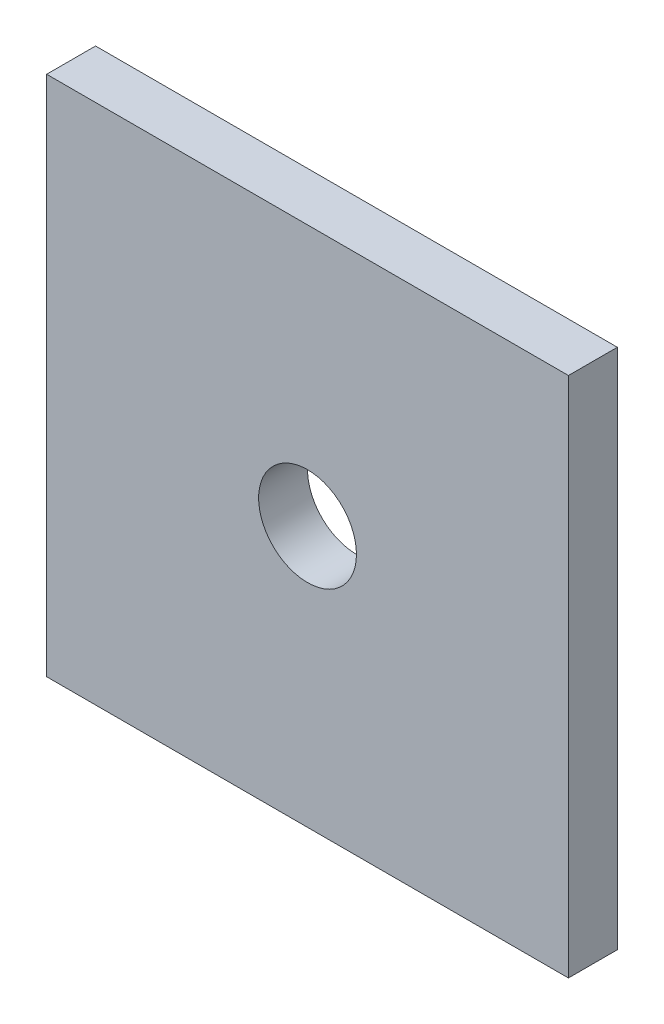
ISO-10303-21;
HEADER;
FILE_DESCRIPTION(('STEP AP214'),'2;1');
FILE_NAME('part.step','',(''),(''),'','','');
FILE_SCHEMA(('AUTOMOTIVE_DESIGN { 1 0 10303 214 1 1 1 1 }'));
ENDSEC;
DATA;
#1=APPLICATION_CONTEXT('core data for automotive mechanical design processes');
#2=APPLICATION_PROTOCOL_DEFINITION('international standard','automotive_design',2000,#1);
#3=PRODUCT_CONTEXT('',#1,'mechanical');
#4=PRODUCT('Part','Part','',(#3));
#5=PRODUCT_RELATED_PRODUCT_CATEGORY('part','',(#4));
#6=PRODUCT_DEFINITION_FORMATION('','',#4);
#7=PRODUCT_DEFINITION_CONTEXT('part definition',#1,'design');
#8=PRODUCT_DEFINITION('design','',#6,#7);
#9=PRODUCT_DEFINITION_SHAPE('','',#8);
#10=(LENGTH_UNIT() NAMED_UNIT(*) SI_UNIT(.MILLI.,.METRE.));
#11=(NAMED_UNIT(*) PLANE_ANGLE_UNIT() SI_UNIT($,.RADIAN.));
#12=(NAMED_UNIT(*) SI_UNIT($,.STERADIAN.) SOLID_ANGLE_UNIT());
#13=UNCERTAINTY_MEASURE_WITH_UNIT(LENGTH_MEASURE(1.E-05),#10,'distance_accuracy_value','');
#14=(GEOMETRIC_REPRESENTATION_CONTEXT(3) GLOBAL_UNCERTAINTY_ASSIGNED_CONTEXT((#13)) GLOBAL_UNIT_ASSIGNED_CONTEXT((#10,
#11,#12)) REPRESENTATION_CONTEXT('',''));
#15=CARTESIAN_POINT('',(0.,0.,0.));
#16=DIRECTION('',(0.,0.,1.));
#17=DIRECTION('',(1.,0.,0.));
#18=AXIS2_PLACEMENT_3D('',#15,#16,#17);
#19=CARTESIAN_POINT('',(-13.4747886581037,19.0476190476191,3.));
#20=DIRECTION('',(1.,0.,0.));
#21=DIRECTION('',(0.,1.,0.));
#22=AXIS2_PLACEMENT_3D('',#19,#20,#21);
#23=PLANE('',#22);
#24=DIRECTION('',(0.,-1.,0.));
#25=VECTOR('',#24,1.);
#26=CARTESIAN_POINT('',(-13.4747886581037,19.0476190476191,0.));
#27=LINE('',#26,#25);
#28=CARTESIAN_POINT('',(-13.4747886581037,19.0476190476191,0.));
#29=VERTEX_POINT('',#28);
#30=CARTESIAN_POINT('',(-13.4747886581037,-12.9523809523809,0.));
#31=VERTEX_POINT('',#30);
#32=EDGE_CURVE('E107',#29,#31,#27,.T.);
#33=ORIENTED_EDGE('',*,*,#32,.T.);
#34=DIRECTION('',(0.,0.,-1.));
#35=VECTOR('',#34,1.);
#36=CARTESIAN_POINT('',(-13.4747886581037,-12.9523809523809,3.));
#37=LINE('',#36,#35);
#38=CARTESIAN_POINT('',(-13.4747886581037,-12.9523809523809,3.));
#39=VERTEX_POINT('',#38);
#40=EDGE_CURVE('E11',#39,#31,#37,.T.);
#41=ORIENTED_EDGE('',*,*,#40,.F.);
#42=DIRECTION('',(0.,-1.,0.));
#43=VECTOR('',#42,1.);
#44=CARTESIAN_POINT('',(-13.4747886581037,19.0476190476191,3.));
#45=LINE('',#44,#43);
#46=CARTESIAN_POINT('',(-13.4747886581037,19.0476190476191,3.));
#47=VERTEX_POINT('',#46);
#48=EDGE_CURVE('E91',#47,#39,#45,.T.);
#49=ORIENTED_EDGE('',*,*,#48,.F.);
#50=DIRECTION('',(0.,0.,-1.));
#51=VECTOR('',#50,1.);
#52=CARTESIAN_POINT('',(-13.4747886581037,19.0476190476191,3.));
#53=LINE('',#52,#51);
#54=EDGE_CURVE('E103',#47,#29,#53,.T.);
#55=ORIENTED_EDGE('',*,*,#54,.T.);
#56=EDGE_LOOP('',(#33,#41,#49,#55));
#57=FACE_BOUND('',#56,.T.);
#58=ADVANCED_FACE('F39',(#57),#23,.F.);
#59=CARTESIAN_POINT('',(-13.4747886581037,-12.9523809523809,3.));
#60=DIRECTION('',(0.,1.,0.));
#61=DIRECTION('',(0.,0.,1.));
#62=AXIS2_PLACEMENT_3D('',#59,#60,#61);
#63=PLANE('',#62);
#64=DIRECTION('',(1.,0.,0.));
#65=VECTOR('',#64,1.);
#66=CARTESIAN_POINT('',(-13.4747886581037,-12.9523809523809,0.));
#67=LINE('',#66,#65);
#68=CARTESIAN_POINT('',(18.5252113418963,-12.9523809523809,0.));
#69=VERTEX_POINT('',#68);
#70=EDGE_CURVE('E96',#31,#69,#67,.T.);
#71=ORIENTED_EDGE('',*,*,#70,.T.);
#72=DIRECTION('',(0.,0.,-1.));
#73=VECTOR('',#72,1.);
#74=CARTESIAN_POINT('',(18.5252113418963,-12.9523809523809,3.));
#75=LINE('',#74,#73);
#76=CARTESIAN_POINT('',(18.5252113418963,-12.9523809523809,3.));
#77=VERTEX_POINT('',#76);
#78=EDGE_CURVE('E48',#77,#69,#75,.T.);
#79=ORIENTED_EDGE('',*,*,#78,.F.);
#80=DIRECTION('',(1.,0.,0.));
#81=VECTOR('',#80,1.);
#82=CARTESIAN_POINT('',(-13.4747886581037,-12.9523809523809,3.));
#83=LINE('',#82,#81);
#84=EDGE_CURVE('E86',#39,#77,#83,.T.);
#85=ORIENTED_EDGE('',*,*,#84,.F.);
#86=ORIENTED_EDGE('',*,*,#40,.T.);
#87=EDGE_LOOP('',(#71,#79,#85,#86));
#88=FACE_BOUND('',#87,.T.);
#89=ADVANCED_FACE('F95',(#88),#63,.F.);
#90=CARTESIAN_POINT('',(18.5252113418963,19.0476190476191,3.));
#91=DIRECTION('',(-1.,0.,0.));
#92=DIRECTION('',(0.,0.,1.));
#93=AXIS2_PLACEMENT_3D('',#90,#91,#92);
#94=PLANE('',#93);
#95=DIRECTION('',(0.,1.,0.));
#96=VECTOR('',#95,1.);
#97=CARTESIAN_POINT('',(18.5252113418963,19.0476190476191,0.));
#98=LINE('',#97,#96);
#99=CARTESIAN_POINT('',(18.5252113418963,19.0476190476191,0.));
#100=VERTEX_POINT('',#99);
#101=EDGE_CURVE('E73',#69,#100,#98,.T.);
#102=ORIENTED_EDGE('',*,*,#101,.T.);
#103=DIRECTION('',(0.,0.,-1.));
#104=VECTOR('',#103,1.);
#105=CARTESIAN_POINT('',(18.5252113418963,19.0476190476191,3.));
#106=LINE('',#105,#104);
#107=CARTESIAN_POINT('',(18.5252113418963,19.0476190476191,3.));
#108=VERTEX_POINT('',#107);
#109=EDGE_CURVE('E98',#108,#100,#106,.T.);
#110=ORIENTED_EDGE('',*,*,#109,.F.);
#111=DIRECTION('',(0.,1.,0.));
#112=VECTOR('',#111,1.);
#113=CARTESIAN_POINT('',(18.5252113418963,19.0476190476191,3.));
#114=LINE('',#113,#112);
#115=EDGE_CURVE('E89',#77,#108,#114,.T.);
#116=ORIENTED_EDGE('',*,*,#115,.F.);
#117=ORIENTED_EDGE('',*,*,#78,.T.);
#118=EDGE_LOOP('',(#102,#110,#116,#117));
#119=FACE_BOUND('',#118,.T.);
#120=ADVANCED_FACE('F99',(#119),#94,.F.);
#121=CARTESIAN_POINT('',(-13.4747886581037,19.0476190476191,3.));
#122=DIRECTION('',(0.,-1.,0.));
#123=DIRECTION('',(0.,0.,-1.));
#124=AXIS2_PLACEMENT_3D('',#121,#122,#123);
#125=PLANE('',#124);
#126=DIRECTION('',(-1.,0.,0.));
#127=VECTOR('',#126,1.);
#128=CARTESIAN_POINT('',(-13.4747886581037,19.0476190476191,0.));
#129=LINE('',#128,#127);
#130=EDGE_CURVE('E79',#100,#29,#129,.T.);
#131=ORIENTED_EDGE('',*,*,#130,.T.);
#132=ORIENTED_EDGE('',*,*,#54,.F.);
#133=DIRECTION('',(-1.,0.,0.));
#134=VECTOR('',#133,1.);
#135=CARTESIAN_POINT('',(-13.4747886581037,19.0476190476191,3.));
#136=LINE('',#135,#134);
#137=EDGE_CURVE('E56',#108,#47,#136,.T.);
#138=ORIENTED_EDGE('',*,*,#137,.F.);
#139=ORIENTED_EDGE('',*,*,#109,.T.);
#140=EDGE_LOOP('',(#131,#132,#138,#139));
#141=FACE_BOUND('',#140,.T.);
#142=ADVANCED_FACE('F121',(#141),#125,.F.);
#143=CARTESIAN_POINT('',(0.,0.,3.));
#144=DIRECTION('',(0.,0.,1.));
#145=DIRECTION('',(1.,0.,0.));
#146=AXIS2_PLACEMENT_3D('',#143,#144,#145);
#147=PLANE('',#146);
#148=CARTESIAN_POINT('',(2.52521134189632,3.04761904761906,3.));
#149=DIRECTION('',(0.,0.,1.));
#150=DIRECTION('',(1.,0.,0.));
#151=AXIS2_PLACEMENT_3D('',#148,#149,#150);
#152=CIRCLE('',#151,3.);
#153=CARTESIAN_POINT('',(5.52521134189632,3.04761904761906,3.));
#154=VERTEX_POINT('',#153);
#155=EDGE_CURVE('E128',#154,#154,#152,.T.);
#156=ORIENTED_EDGE('',*,*,#155,.F.);
#157=EDGE_LOOP('',(#156));
#158=FACE_BOUND('',#157,.T.);
#159=ORIENTED_EDGE('',*,*,#48,.T.);
#160=ORIENTED_EDGE('',*,*,#84,.T.);
#161=ORIENTED_EDGE('',*,*,#115,.T.);
#162=ORIENTED_EDGE('',*,*,#137,.T.);
#163=EDGE_LOOP('',(#159,#160,#161,#162));
#164=FACE_BOUND('',#163,.T.);
#165=ADVANCED_FACE('F87',(#158,#164),#147,.T.);
#166=CARTESIAN_POINT('',(0.,0.,0.));
#167=DIRECTION('',(0.,0.,1.));
#168=DIRECTION('',(1.,0.,0.));
#169=AXIS2_PLACEMENT_3D('',#166,#167,#168);
#170=PLANE('',#169);
#171=CARTESIAN_POINT('',(2.52521134189632,3.04761904761906,0.));
#172=DIRECTION('',(0.,0.,1.));
#173=DIRECTION('',(1.,0.,0.));
#174=AXIS2_PLACEMENT_3D('',#171,#172,#173);
#175=CIRCLE('',#174,3.);
#176=CARTESIAN_POINT('',(5.52521134189632,3.04761904761906,0.));
#177=VERTEX_POINT('',#176);
#178=EDGE_CURVE('E111',#177,#177,#175,.T.);
#179=ORIENTED_EDGE('',*,*,#178,.T.);
#180=EDGE_LOOP('',(#179));
#181=FACE_BOUND('',#180,.T.);
#182=ORIENTED_EDGE('',*,*,#32,.F.);
#183=ORIENTED_EDGE('',*,*,#130,.F.);
#184=ORIENTED_EDGE('',*,*,#101,.F.);
#185=ORIENTED_EDGE('',*,*,#70,.F.);
#186=EDGE_LOOP('',(#182,#183,#184,#185));
#187=FACE_BOUND('',#186,.T.);
#188=ADVANCED_FACE('F124',(#181,#187),#170,.F.);
#189=CARTESIAN_POINT('',(2.52521134189632,3.04761904761906,0.));
#190=DIRECTION('',(0.,0.,1.));
#191=DIRECTION('',(1.,0.,0.));
#192=AXIS2_PLACEMENT_3D('',#189,#190,#191);
#193=CYLINDRICAL_SURFACE('',#192,3.);
#194=ORIENTED_EDGE('',*,*,#178,.F.);
#195=EDGE_LOOP('',(#194));
#196=FACE_BOUND('',#195,.T.);
#197=ORIENTED_EDGE('',*,*,#155,.T.);
#198=EDGE_LOOP('',(#197));
#199=FACE_BOUND('',#198,.T.);
#200=ADVANCED_FACE('F137',(#196,#199),#193,.F.);
#201=CLOSED_SHELL('',(#58,#89,#120,#142,#165,#188,#200));
#202=MANIFOLD_SOLID_BREP('B2',#201);
#203=ADVANCED_BREP_SHAPE_REPRESENTATION('',(#18,#202),#14);
#204=SHAPE_DEFINITION_REPRESENTATION(#9,#203);
ENDSEC;
END-ISO-10303-21;
